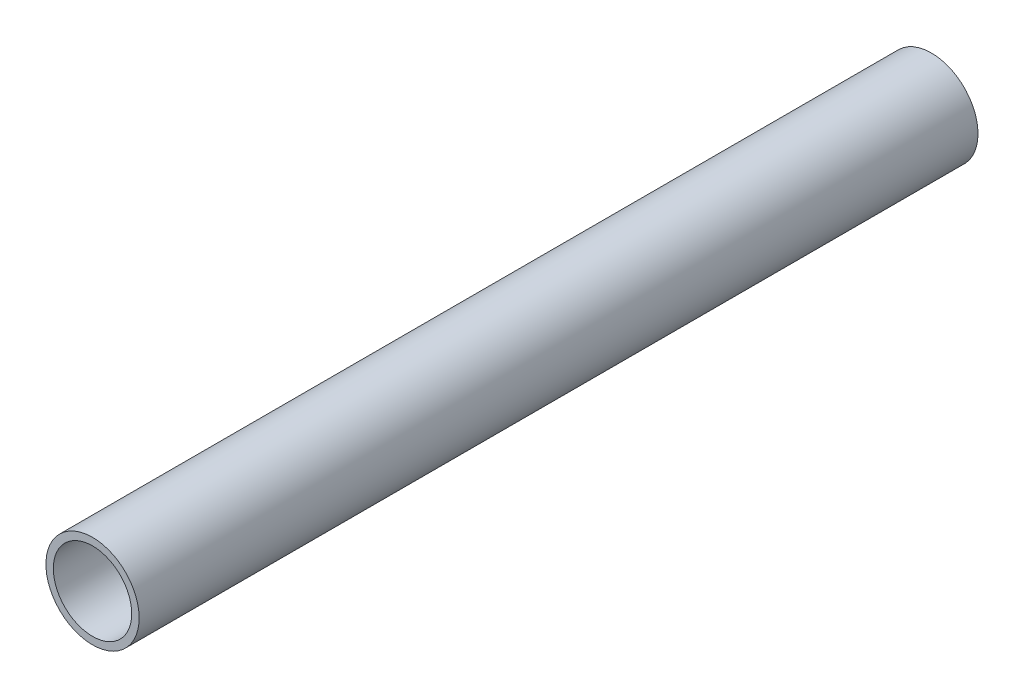
ISO-10303-21;
HEADER;
FILE_DESCRIPTION(('STEP AP214'),'2;1');
FILE_NAME('part.step','',(''),(''),'','','');
FILE_SCHEMA(('AUTOMOTIVE_DESIGN { 1 0 10303 214 1 1 1 1 }'));
ENDSEC;
DATA;
#1=APPLICATION_CONTEXT('core data for automotive mechanical design processes');
#2=APPLICATION_PROTOCOL_DEFINITION('international standard','automotive_design',2000,#1);
#3=PRODUCT_CONTEXT('',#1,'mechanical');
#4=PRODUCT('Part','Part','',(#3));
#5=PRODUCT_RELATED_PRODUCT_CATEGORY('part','',(#4));
#6=PRODUCT_DEFINITION_FORMATION('','',#4);
#7=PRODUCT_DEFINITION_CONTEXT('part definition',#1,'design');
#8=PRODUCT_DEFINITION('design','',#6,#7);
#9=PRODUCT_DEFINITION_SHAPE('','',#8);
#10=(LENGTH_UNIT() NAMED_UNIT(*) SI_UNIT(.MILLI.,.METRE.));
#11=(NAMED_UNIT(*) PLANE_ANGLE_UNIT() SI_UNIT($,.RADIAN.));
#12=(NAMED_UNIT(*) SI_UNIT($,.STERADIAN.) SOLID_ANGLE_UNIT());
#13=UNCERTAINTY_MEASURE_WITH_UNIT(LENGTH_MEASURE(1.E-05),#10,'distance_accuracy_value','');
#14=(GEOMETRIC_REPRESENTATION_CONTEXT(3) GLOBAL_UNCERTAINTY_ASSIGNED_CONTEXT((#13)) GLOBAL_UNIT_ASSIGNED_CONTEXT((#10,
#11,#12)) REPRESENTATION_CONTEXT('',''));
#15=CARTESIAN_POINT('',(0.,0.,0.));
#16=DIRECTION('',(0.,0.,1.));
#17=DIRECTION('',(1.,0.,0.));
#18=AXIS2_PLACEMENT_3D('',#15,#16,#17);
#19=CARTESIAN_POINT('',(0.,0.,914.4));
#20=DIRECTION('',(0.,0.,1.));
#21=DIRECTION('',(1.,0.,0.));
#22=AXIS2_PLACEMENT_3D('',#19,#20,#21);
#23=PLANE('',#22);
#24=CARTESIAN_POINT('',(0.,0.,914.4));
#25=DIRECTION('',(0.,0.,1.));
#26=DIRECTION('',(1.,0.,0.));
#27=AXIS2_PLACEMENT_3D('',#24,#25,#26);
#28=CIRCLE('',#27,50.8000000000001);
#29=CARTESIAN_POINT('',(50.8000000000001,0.,914.4));
#30=VERTEX_POINT('',#29);
#31=EDGE_CURVE('E10',#30,#30,#28,.T.);
#32=ORIENTED_EDGE('',*,*,#31,.T.);
#33=EDGE_LOOP('',(#32));
#34=FACE_BOUND('',#33,.T.);
#35=CARTESIAN_POINT('',(0.,0.,914.4));
#36=DIRECTION('',(0.,0.,1.));
#37=DIRECTION('',(1.,0.,0.));
#38=AXIS2_PLACEMENT_3D('',#35,#36,#37);
#39=CIRCLE('',#38,42.7355000000001);
#40=CARTESIAN_POINT('',(42.7355000000001,0.,914.4));
#41=VERTEX_POINT('',#40);
#42=EDGE_CURVE('E42',#41,#41,#39,.T.);
#43=ORIENTED_EDGE('',*,*,#42,.F.);
#44=EDGE_LOOP('',(#43));
#45=FACE_BOUND('',#44,.T.);
#46=ADVANCED_FACE('F31',(#34,#45),#23,.T.);
#47=CARTESIAN_POINT('',(0.,0.,0.));
#48=DIRECTION('',(0.,0.,1.));
#49=DIRECTION('',(1.,0.,0.));
#50=AXIS2_PLACEMENT_3D('',#47,#48,#49);
#51=PLANE('',#50);
#52=CARTESIAN_POINT('',(0.,0.,0.));
#53=DIRECTION('',(0.,0.,1.));
#54=DIRECTION('',(1.,0.,0.));
#55=AXIS2_PLACEMENT_3D('',#52,#53,#54);
#56=CIRCLE('',#55,50.8000000000001);
#57=CARTESIAN_POINT('',(50.8000000000001,0.,0.));
#58=VERTEX_POINT('',#57);
#59=EDGE_CURVE('E35',#58,#58,#56,.T.);
#60=ORIENTED_EDGE('',*,*,#59,.F.);
#61=EDGE_LOOP('',(#60));
#62=FACE_BOUND('',#61,.T.);
#63=CARTESIAN_POINT('',(0.,0.,0.));
#64=DIRECTION('',(0.,0.,1.));
#65=DIRECTION('',(1.,0.,0.));
#66=AXIS2_PLACEMENT_3D('',#63,#64,#65);
#67=CIRCLE('',#66,42.7355000000001);
#68=CARTESIAN_POINT('',(42.7355000000001,0.,0.));
#69=VERTEX_POINT('',#68);
#70=EDGE_CURVE('E44',#69,#69,#67,.T.);
#71=ORIENTED_EDGE('',*,*,#70,.T.);
#72=EDGE_LOOP('',(#71));
#73=FACE_BOUND('',#72,.T.);
#74=ADVANCED_FACE('F54',(#62,#73),#51,.F.);
#75=CARTESIAN_POINT('',(0.,0.,914.4));
#76=DIRECTION('',(0.,0.,-1.));
#77=DIRECTION('',(-1.,0.,0.));
#78=AXIS2_PLACEMENT_3D('',#75,#76,#77);
#79=CYLINDRICAL_SURFACE('',#78,50.8000000000001);
#80=ORIENTED_EDGE('',*,*,#31,.F.);
#81=EDGE_LOOP('',(#80));
#82=FACE_BOUND('',#81,.T.);
#83=ORIENTED_EDGE('',*,*,#59,.T.);
#84=EDGE_LOOP('',(#83));
#85=FACE_BOUND('',#84,.T.);
#86=ADVANCED_FACE('F33',(#82,#85),#79,.T.);
#87=CARTESIAN_POINT('',(0.,0.,914.4));
#88=DIRECTION('',(0.,0.,-1.));
#89=DIRECTION('',(-1.,0.,0.));
#90=AXIS2_PLACEMENT_3D('',#87,#88,#89);
#91=CYLINDRICAL_SURFACE('',#90,42.7355000000001);
#92=ORIENTED_EDGE('',*,*,#42,.T.);
#93=EDGE_LOOP('',(#92));
#94=FACE_BOUND('',#93,.T.);
#95=ORIENTED_EDGE('',*,*,#70,.F.);
#96=EDGE_LOOP('',(#95));
#97=FACE_BOUND('',#96,.T.);
#98=ADVANCED_FACE('F50',(#94,#97),#91,.F.);
#99=CLOSED_SHELL('',(#46,#74,#86,#98));
#100=MANIFOLD_SOLID_BREP('B2',#99);
#101=ADVANCED_BREP_SHAPE_REPRESENTATION('',(#18,#100),#14);
#102=SHAPE_DEFINITION_REPRESENTATION(#9,#101);
ENDSEC;
END-ISO-10303-21;
